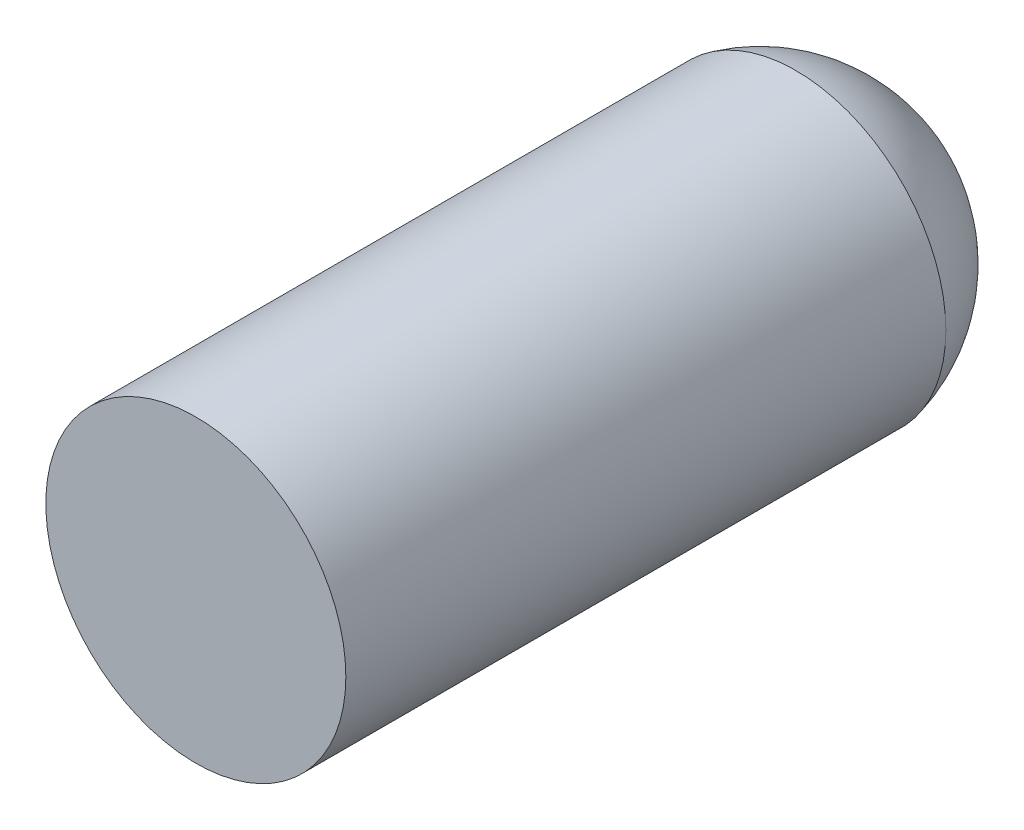
ISO-10303-21;
HEADER;
FILE_DESCRIPTION(('STEP AP214'),'2;1');
FILE_NAME('part.step','',(''),(''),'','','');
FILE_SCHEMA(('AUTOMOTIVE_DESIGN { 1 0 10303 214 1 1 1 1 }'));
ENDSEC;
DATA;
#1=APPLICATION_CONTEXT('core data for automotive mechanical design processes');
#2=APPLICATION_PROTOCOL_DEFINITION('international standard','automotive_design',2000,#1);
#3=PRODUCT_CONTEXT('',#1,'mechanical');
#4=PRODUCT('Part','Part','',(#3));
#5=PRODUCT_RELATED_PRODUCT_CATEGORY('part','',(#4));
#6=PRODUCT_DEFINITION_FORMATION('','',#4);
#7=PRODUCT_DEFINITION_CONTEXT('part definition',#1,'design');
#8=PRODUCT_DEFINITION('design','',#6,#7);
#9=PRODUCT_DEFINITION_SHAPE('','',#8);
#10=(LENGTH_UNIT() NAMED_UNIT(*) SI_UNIT(.MILLI.,.METRE.));
#11=(NAMED_UNIT(*) PLANE_ANGLE_UNIT() SI_UNIT($,.RADIAN.));
#12=(NAMED_UNIT(*) SI_UNIT($,.STERADIAN.) SOLID_ANGLE_UNIT());
#13=UNCERTAINTY_MEASURE_WITH_UNIT(LENGTH_MEASURE(1.E-05),#10,'distance_accuracy_value','');
#14=(GEOMETRIC_REPRESENTATION_CONTEXT(3) GLOBAL_UNCERTAINTY_ASSIGNED_CONTEXT((#13)) GLOBAL_UNIT_ASSIGNED_CONTEXT((#10,
#11,#12)) REPRESENTATION_CONTEXT('',''));
#15=CARTESIAN_POINT('',(0.,0.,0.));
#16=DIRECTION('',(0.,0.,1.));
#17=DIRECTION('',(1.,0.,0.));
#18=AXIS2_PLACEMENT_3D('',#15,#16,#17);
#19=CARTESIAN_POINT('',(0.,0.,25.4));
#20=DIRECTION('',(0.,0.,-1.));
#21=DIRECTION('',(-1.,0.,0.));
#22=AXIS2_PLACEMENT_3D('',#19,#20,#21);
#23=CYLINDRICAL_SURFACE('',#22,6.35);
#24=CARTESIAN_POINT('',(0.,0.,25.4));
#25=DIRECTION('',(0.,0.,1.));
#26=DIRECTION('',(1.,0.,0.));
#27=AXIS2_PLACEMENT_3D('',#24,#25,#26);
#28=CIRCLE('',#27,6.35);
#29=CARTESIAN_POINT('',(6.35,0.,25.4));
#30=VERTEX_POINT('',#29);
#31=EDGE_CURVE('E10',#30,#30,#28,.T.);
#32=ORIENTED_EDGE('',*,*,#31,.F.);
#33=EDGE_LOOP('',(#32));
#34=FACE_BOUND('',#33,.T.);
#35=CARTESIAN_POINT('',(0.,0.,0.));
#36=DIRECTION('',(0.,0.,1.));
#37=DIRECTION('',(1.,0.,0.));
#38=AXIS2_PLACEMENT_3D('',#35,#36,#37);
#39=CIRCLE('',#38,6.35);
#40=CARTESIAN_POINT('',(6.35,0.,0.));
#41=VERTEX_POINT('',#40);
#42=EDGE_CURVE('E50',#41,#41,#39,.T.);
#43=ORIENTED_EDGE('',*,*,#42,.T.);
#44=EDGE_LOOP('',(#43));
#45=FACE_BOUND('',#44,.T.);
#46=ADVANCED_FACE('F43',(#34,#45),#23,.T.);
#47=CARTESIAN_POINT('',(0.,0.,25.4));
#48=DIRECTION('',(0.,0.,1.));
#49=DIRECTION('',(1.,0.,0.));
#50=AXIS2_PLACEMENT_3D('',#47,#48,#49);
#51=PLANE('',#50);
#52=ORIENTED_EDGE('',*,*,#31,.T.);
#53=EDGE_LOOP('',(#52));
#54=FACE_BOUND('',#53,.T.);
#55=ADVANCED_FACE('F60',(#54),#51,.T.);
#56=CARTESIAN_POINT('',(0.,0.,1.51540277373683));
#57=DIRECTION('',(0.,0.,1.));
#58=DIRECTION('',(1.,0.,0.));
#59=AXIS2_PLACEMENT_3D('',#56,#57,#58);
#60=SPHERICAL_SURFACE('',#59,6.52831873966409);
#61=ORIENTED_EDGE('',*,*,#42,.F.);
#62=EDGE_LOOP('',(#61));
#63=FACE_BOUND('',#62,.T.);
#64=ADVANCED_FACE('F58',(#63),#60,.T.);
#65=CLOSED_SHELL('',(#46,#55,#64));
#66=MANIFOLD_SOLID_BREP('B2',#65);
#67=ADVANCED_BREP_SHAPE_REPRESENTATION('',(#18,#66),#14);
#68=SHAPE_DEFINITION_REPRESENTATION(#9,#67);
ENDSEC;
END-ISO-10303-21;
